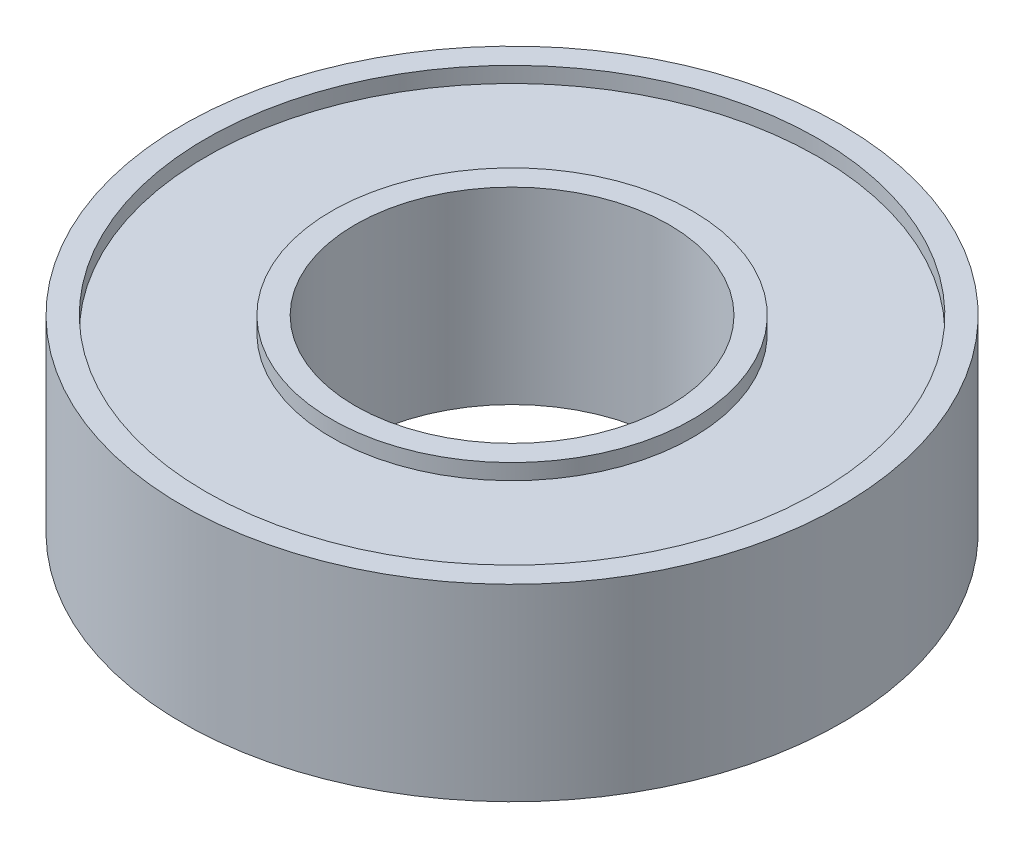
ISO-10303-21;
HEADER;
FILE_DESCRIPTION(('STEP AP214'),'2;1');
FILE_NAME('part.step','',(''),(''),'','','');
FILE_SCHEMA(('AUTOMOTIVE_DESIGN { 1 0 10303 214 1 1 1 1 }'));
ENDSEC;
DATA;
#1=APPLICATION_CONTEXT('core data for automotive mechanical design processes');
#2=APPLICATION_PROTOCOL_DEFINITION('international standard','automotive_design',2000,#1);
#3=PRODUCT_CONTEXT('',#1,'mechanical');
#4=PRODUCT('Part','Part','',(#3));
#5=PRODUCT_RELATED_PRODUCT_CATEGORY('part','',(#4));
#6=PRODUCT_DEFINITION_FORMATION('','',#4);
#7=PRODUCT_DEFINITION_CONTEXT('part definition',#1,'design');
#8=PRODUCT_DEFINITION('design','',#6,#7);
#9=PRODUCT_DEFINITION_SHAPE('','',#8);
#10=(LENGTH_UNIT() NAMED_UNIT(*) SI_UNIT(.MILLI.,.METRE.));
#11=(NAMED_UNIT(*) PLANE_ANGLE_UNIT() SI_UNIT($,.RADIAN.));
#12=(NAMED_UNIT(*) SI_UNIT($,.STERADIAN.) SOLID_ANGLE_UNIT());
#13=UNCERTAINTY_MEASURE_WITH_UNIT(LENGTH_MEASURE(1.E-05),#10,'distance_accuracy_value','');
#14=(GEOMETRIC_REPRESENTATION_CONTEXT(3) GLOBAL_UNCERTAINTY_ASSIGNED_CONTEXT((#13)) GLOBAL_UNIT_ASSIGNED_CONTEXT((#10,
#11,#12)) REPRESENTATION_CONTEXT('',''));
#15=CARTESIAN_POINT('',(0.,0.,0.));
#16=DIRECTION('',(0.,0.,1.));
#17=DIRECTION('',(1.,0.,0.));
#18=AXIS2_PLACEMENT_3D('',#15,#16,#17);
#19=CARTESIAN_POINT('',(-11.5,6.85670535698484,0.));
#20=DIRECTION('',(0.,1.,0.));
#21=DIRECTION('',(0.,0.,1.));
#22=AXIS2_PLACEMENT_3D('',#19,#20,#21);
#23=PLANE('',#22);
#24=CARTESIAN_POINT('',(0.,6.85670535698484,0.));
#25=DIRECTION('',(0.,-1.,0.));
#26=DIRECTION('',(0.,0.,-1.));
#27=AXIS2_PLACEMENT_3D('',#24,#25,#26);
#28=CIRCLE('',#27,10.);
#29=CARTESIAN_POINT('',(0.,6.85670535698484,-10.));
#30=VERTEX_POINT('',#29);
#31=EDGE_CURVE('E10',#30,#30,#28,.T.);
#32=ORIENTED_EDGE('',*,*,#31,.F.);
#33=EDGE_LOOP('',(#32));
#34=FACE_BOUND('',#33,.T.);
#35=CARTESIAN_POINT('',(0.,6.85670535698484,0.));
#36=DIRECTION('',(0.,-1.,0.));
#37=DIRECTION('',(0.,0.,-1.));
#38=AXIS2_PLACEMENT_3D('',#35,#36,#37);
#39=CIRCLE('',#38,11.5);
#40=CARTESIAN_POINT('',(0.,6.85670535698484,-11.5));
#41=VERTEX_POINT('',#40);
#42=EDGE_CURVE('E70',#41,#41,#39,.T.);
#43=ORIENTED_EDGE('',*,*,#42,.T.);
#44=EDGE_LOOP('',(#43));
#45=FACE_BOUND('',#44,.T.);
#46=ADVANCED_FACE('F30',(#34,#45),#23,.F.);
#47=CARTESIAN_POINT('',(0.,0.,0.));
#48=DIRECTION('',(0.,-1.,0.));
#49=DIRECTION('',(0.,0.,-1.));
#50=AXIS2_PLACEMENT_3D('',#47,#48,#49);
#51=CYLINDRICAL_SURFACE('',#50,10.);
#52=CARTESIAN_POINT('',(0.,18.8567053569848,0.));
#53=DIRECTION('',(0.,-1.,0.));
#54=DIRECTION('',(0.,0.,-1.));
#55=AXIS2_PLACEMENT_3D('',#52,#53,#54);
#56=CIRCLE('',#55,10.);
#57=CARTESIAN_POINT('',(0.,18.8567053569848,-10.));
#58=VERTEX_POINT('',#57);
#59=EDGE_CURVE('E36',#58,#58,#56,.T.);
#60=ORIENTED_EDGE('',*,*,#59,.F.);
#61=EDGE_LOOP('',(#60));
#62=FACE_BOUND('',#61,.T.);
#63=ORIENTED_EDGE('',*,*,#31,.T.);
#64=EDGE_LOOP('',(#63));
#65=FACE_BOUND('',#64,.T.);
#66=ADVANCED_FACE('F131',(#62,#65),#51,.F.);
#67=CARTESIAN_POINT('',(-10.,18.8567053569848,0.));
#68=DIRECTION('',(0.,-1.,0.));
#69=DIRECTION('',(0.,0.,-1.));
#70=AXIS2_PLACEMENT_3D('',#67,#68,#69);
#71=PLANE('',#70);
#72=CARTESIAN_POINT('',(0.,18.8567053569848,0.));
#73=DIRECTION('',(0.,-1.,0.));
#74=DIRECTION('',(0.,0.,-1.));
#75=AXIS2_PLACEMENT_3D('',#72,#73,#74);
#76=CIRCLE('',#75,11.5);
#77=CARTESIAN_POINT('',(0.,18.8567053569848,-11.5));
#78=VERTEX_POINT('',#77);
#79=EDGE_CURVE('E40',#78,#78,#76,.T.);
#80=ORIENTED_EDGE('',*,*,#79,.F.);
#81=EDGE_LOOP('',(#80));
#82=FACE_BOUND('',#81,.T.);
#83=ORIENTED_EDGE('',*,*,#59,.T.);
#84=EDGE_LOOP('',(#83));
#85=FACE_BOUND('',#84,.T.);
#86=ADVANCED_FACE('F126',(#82,#85),#71,.F.);
#87=CARTESIAN_POINT('',(0.,0.,0.));
#88=DIRECTION('',(0.,-1.,0.));
#89=DIRECTION('',(0.,0.,-1.));
#90=AXIS2_PLACEMENT_3D('',#87,#88,#89);
#91=CYLINDRICAL_SURFACE('',#90,11.5);
#92=CARTESIAN_POINT('',(0.,17.8567053569848,0.));
#93=DIRECTION('',(0.,-1.,0.));
#94=DIRECTION('',(0.,0.,-1.));
#95=AXIS2_PLACEMENT_3D('',#92,#93,#94);
#96=CIRCLE('',#95,11.5);
#97=CARTESIAN_POINT('',(0.,17.8567053569848,-11.5));
#98=VERTEX_POINT('',#97);
#99=EDGE_CURVE('E44',#98,#98,#96,.T.);
#100=ORIENTED_EDGE('',*,*,#99,.F.);
#101=EDGE_LOOP('',(#100));
#102=FACE_BOUND('',#101,.T.);
#103=ORIENTED_EDGE('',*,*,#79,.T.);
#104=EDGE_LOOP('',(#103));
#105=FACE_BOUND('',#104,.T.);
#106=ADVANCED_FACE('F120',(#102,#105),#91,.T.);
#107=CARTESIAN_POINT('',(-11.5,17.8567053569848,0.));
#108=DIRECTION('',(0.,-1.,0.));
#109=DIRECTION('',(0.,0.,-1.));
#110=AXIS2_PLACEMENT_3D('',#107,#108,#109);
#111=PLANE('',#110);
#112=CARTESIAN_POINT('',(0.,17.8567053569848,0.));
#113=DIRECTION('',(0.,-1.,0.));
#114=DIRECTION('',(0.,0.,-1.));
#115=AXIS2_PLACEMENT_3D('',#112,#113,#114);
#116=CIRCLE('',#115,19.5);
#117=CARTESIAN_POINT('',(0.,17.8567053569848,-19.5));
#118=VERTEX_POINT('',#117);
#119=EDGE_CURVE('E49',#118,#118,#116,.T.);
#120=ORIENTED_EDGE('',*,*,#119,.F.);
#121=EDGE_LOOP('',(#120));
#122=FACE_BOUND('',#121,.T.);
#123=ORIENTED_EDGE('',*,*,#99,.T.);
#124=EDGE_LOOP('',(#123));
#125=FACE_BOUND('',#124,.T.);
#126=ADVANCED_FACE('F114',(#122,#125),#111,.F.);
#127=CARTESIAN_POINT('',(0.,0.,0.));
#128=DIRECTION('',(0.,-1.,0.));
#129=DIRECTION('',(0.,0.,-1.));
#130=AXIS2_PLACEMENT_3D('',#127,#128,#129);
#131=CYLINDRICAL_SURFACE('',#130,19.5);
#132=CARTESIAN_POINT('',(0.,18.8567053569848,0.));
#133=DIRECTION('',(0.,-1.,0.));
#134=DIRECTION('',(0.,0.,-1.));
#135=AXIS2_PLACEMENT_3D('',#132,#133,#134);
#136=CIRCLE('',#135,19.5);
#137=CARTESIAN_POINT('',(0.,18.8567053569848,-19.5));
#138=VERTEX_POINT('',#137);
#139=EDGE_CURVE('E52',#138,#138,#136,.T.);
#140=ORIENTED_EDGE('',*,*,#139,.F.);
#141=EDGE_LOOP('',(#140));
#142=FACE_BOUND('',#141,.T.);
#143=ORIENTED_EDGE('',*,*,#119,.T.);
#144=EDGE_LOOP('',(#143));
#145=FACE_BOUND('',#144,.T.);
#146=ADVANCED_FACE('F108',(#142,#145),#131,.F.);
#147=CARTESIAN_POINT('',(-19.5,18.8567053569848,0.));
#148=DIRECTION('',(0.,-1.,0.));
#149=DIRECTION('',(0.,0.,-1.));
#150=AXIS2_PLACEMENT_3D('',#147,#148,#149);
#151=PLANE('',#150);
#152=CARTESIAN_POINT('',(0.,18.8567053569848,0.));
#153=DIRECTION('',(0.,-1.,0.));
#154=DIRECTION('',(0.,0.,-1.));
#155=AXIS2_PLACEMENT_3D('',#152,#153,#154);
#156=CIRCLE('',#155,21.);
#157=CARTESIAN_POINT('',(0.,18.8567053569848,-21.));
#158=VERTEX_POINT('',#157);
#159=EDGE_CURVE('E55',#158,#158,#156,.T.);
#160=ORIENTED_EDGE('',*,*,#159,.F.);
#161=EDGE_LOOP('',(#160));
#162=FACE_BOUND('',#161,.T.);
#163=ORIENTED_EDGE('',*,*,#139,.T.);
#164=EDGE_LOOP('',(#163));
#165=FACE_BOUND('',#164,.T.);
#166=ADVANCED_FACE('F102',(#162,#165),#151,.F.);
#167=CARTESIAN_POINT('',(0.,0.,0.));
#168=DIRECTION('',(0.,-1.,0.));
#169=DIRECTION('',(0.,0.,-1.));
#170=AXIS2_PLACEMENT_3D('',#167,#168,#169);
#171=CYLINDRICAL_SURFACE('',#170,21.);
#172=CARTESIAN_POINT('',(0.,6.85670535698484,0.));
#173=DIRECTION('',(0.,-1.,0.));
#174=DIRECTION('',(0.,0.,-1.));
#175=AXIS2_PLACEMENT_3D('',#172,#173,#174);
#176=CIRCLE('',#175,21.);
#177=CARTESIAN_POINT('',(0.,6.85670535698484,-21.));
#178=VERTEX_POINT('',#177);
#179=EDGE_CURVE('E58',#178,#178,#176,.T.);
#180=ORIENTED_EDGE('',*,*,#179,.F.);
#181=EDGE_LOOP('',(#180));
#182=FACE_BOUND('',#181,.T.);
#183=ORIENTED_EDGE('',*,*,#159,.T.);
#184=EDGE_LOOP('',(#183));
#185=FACE_BOUND('',#184,.T.);
#186=ADVANCED_FACE('F96',(#182,#185),#171,.T.);
#187=CARTESIAN_POINT('',(-21.,6.85670535698484,0.));
#188=DIRECTION('',(0.,1.,0.));
#189=DIRECTION('',(0.,0.,1.));
#190=AXIS2_PLACEMENT_3D('',#187,#188,#189);
#191=PLANE('',#190);
#192=CARTESIAN_POINT('',(0.,6.85670535698484,0.));
#193=DIRECTION('',(0.,-1.,0.));
#194=DIRECTION('',(0.,0.,-1.));
#195=AXIS2_PLACEMENT_3D('',#192,#193,#194);
#196=CIRCLE('',#195,19.5);
#197=CARTESIAN_POINT('',(0.,6.85670535698484,-19.5));
#198=VERTEX_POINT('',#197);
#199=EDGE_CURVE('E61',#198,#198,#196,.T.);
#200=ORIENTED_EDGE('',*,*,#199,.F.);
#201=EDGE_LOOP('',(#200));
#202=FACE_BOUND('',#201,.T.);
#203=ORIENTED_EDGE('',*,*,#179,.T.);
#204=EDGE_LOOP('',(#203));
#205=FACE_BOUND('',#204,.T.);
#206=ADVANCED_FACE('F90',(#202,#205),#191,.F.);
#207=CARTESIAN_POINT('',(0.,0.,0.));
#208=DIRECTION('',(0.,-1.,0.));
#209=DIRECTION('',(0.,0.,-1.));
#210=AXIS2_PLACEMENT_3D('',#207,#208,#209);
#211=CYLINDRICAL_SURFACE('',#210,19.5);
#212=CARTESIAN_POINT('',(0.,7.85670535698484,0.));
#213=DIRECTION('',(0.,-1.,0.));
#214=DIRECTION('',(0.,0.,-1.));
#215=AXIS2_PLACEMENT_3D('',#212,#213,#214);
#216=CIRCLE('',#215,19.5);
#217=CARTESIAN_POINT('',(0.,7.85670535698484,-19.5));
#218=VERTEX_POINT('',#217);
#219=EDGE_CURVE('E64',#218,#218,#216,.T.);
#220=ORIENTED_EDGE('',*,*,#219,.F.);
#221=EDGE_LOOP('',(#220));
#222=FACE_BOUND('',#221,.T.);
#223=ORIENTED_EDGE('',*,*,#199,.T.);
#224=EDGE_LOOP('',(#223));
#225=FACE_BOUND('',#224,.T.);
#226=ADVANCED_FACE('F84',(#222,#225),#211,.F.);
#227=CARTESIAN_POINT('',(-19.5,7.85670535698484,0.));
#228=DIRECTION('',(0.,1.,0.));
#229=DIRECTION('',(0.,0.,1.));
#230=AXIS2_PLACEMENT_3D('',#227,#228,#229);
#231=PLANE('',#230);
#232=CARTESIAN_POINT('',(0.,7.85670535698484,0.));
#233=DIRECTION('',(0.,-1.,0.));
#234=DIRECTION('',(0.,0.,-1.));
#235=AXIS2_PLACEMENT_3D('',#232,#233,#234);
#236=CIRCLE('',#235,11.5);
#237=CARTESIAN_POINT('',(0.,7.85670535698484,-11.5));
#238=VERTEX_POINT('',#237);
#239=EDGE_CURVE('E67',#238,#238,#236,.T.);
#240=ORIENTED_EDGE('',*,*,#239,.F.);
#241=EDGE_LOOP('',(#240));
#242=FACE_BOUND('',#241,.T.);
#243=ORIENTED_EDGE('',*,*,#219,.T.);
#244=EDGE_LOOP('',(#243));
#245=FACE_BOUND('',#244,.T.);
#246=ADVANCED_FACE('F78',(#242,#245),#231,.F.);
#247=CARTESIAN_POINT('',(0.,0.,0.));
#248=DIRECTION('',(0.,-1.,0.));
#249=DIRECTION('',(0.,0.,-1.));
#250=AXIS2_PLACEMENT_3D('',#247,#248,#249);
#251=CYLINDRICAL_SURFACE('',#250,11.5);
#252=ORIENTED_EDGE('',*,*,#42,.F.);
#253=EDGE_LOOP('',(#252));
#254=FACE_BOUND('',#253,.T.);
#255=ORIENTED_EDGE('',*,*,#239,.T.);
#256=EDGE_LOOP('',(#255));
#257=FACE_BOUND('',#256,.T.);
#258=ADVANCED_FACE('F75',(#254,#257),#251,.T.);
#259=CLOSED_SHELL('',(#46,#66,#86,#106,#126,#146,#166,#186,#206,#226,#246,#258));
#260=MANIFOLD_SOLID_BREP('B2',#259);
#261=ADVANCED_BREP_SHAPE_REPRESENTATION('',(#18,#260),#14);
#262=SHAPE_DEFINITION_REPRESENTATION(#9,#261);
ENDSEC;
END-ISO-10303-21;
